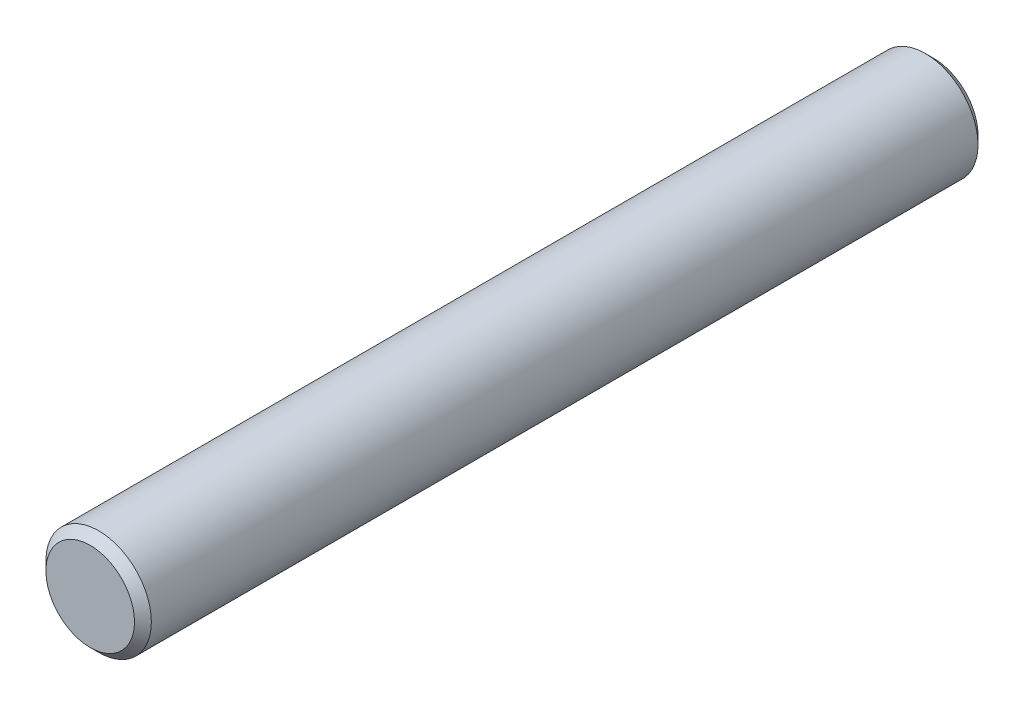
ISO-10303-21;
HEADER;
FILE_DESCRIPTION(('STEP AP214'),'2;1');
FILE_NAME('part.step','',(''),(''),'','','');
FILE_SCHEMA(('AUTOMOTIVE_DESIGN { 1 0 10303 214 1 1 1 1 }'));
ENDSEC;
DATA;
#1=APPLICATION_CONTEXT('core data for automotive mechanical design processes');
#2=APPLICATION_PROTOCOL_DEFINITION('international standard','automotive_design',2000,#1);
#3=PRODUCT_CONTEXT('',#1,'mechanical');
#4=PRODUCT('Part','Part','',(#3));
#5=PRODUCT_RELATED_PRODUCT_CATEGORY('part','',(#4));
#6=PRODUCT_DEFINITION_FORMATION('','',#4);
#7=PRODUCT_DEFINITION_CONTEXT('part definition',#1,'design');
#8=PRODUCT_DEFINITION('design','',#6,#7);
#9=PRODUCT_DEFINITION_SHAPE('','',#8);
#10=(LENGTH_UNIT() NAMED_UNIT(*) SI_UNIT(.MILLI.,.METRE.));
#11=(NAMED_UNIT(*) PLANE_ANGLE_UNIT() SI_UNIT($,.RADIAN.));
#12=(NAMED_UNIT(*) SI_UNIT($,.STERADIAN.) SOLID_ANGLE_UNIT());
#13=UNCERTAINTY_MEASURE_WITH_UNIT(LENGTH_MEASURE(1.E-05),#10,'distance_accuracy_value','');
#14=(GEOMETRIC_REPRESENTATION_CONTEXT(3) GLOBAL_UNCERTAINTY_ASSIGNED_CONTEXT((#13)) GLOBAL_UNIT_ASSIGNED_CONTEXT((#10,
#11,#12)) REPRESENTATION_CONTEXT('',''));
#15=CARTESIAN_POINT('',(0.,0.,0.));
#16=DIRECTION('',(0.,0.,1.));
#17=DIRECTION('',(1.,0.,0.));
#18=AXIS2_PLACEMENT_3D('',#15,#16,#17);
#19=CARTESIAN_POINT('',(0.,0.,25.4));
#20=DIRECTION('',(0.,0.,-1.));
#21=DIRECTION('',(-1.,0.,0.));
#22=AXIS2_PLACEMENT_3D('',#19,#20,#21);
#23=CYLINDRICAL_SURFACE('',#22,1.5875);
#24=CARTESIAN_POINT('',(0.,0.,25.146));
#25=DIRECTION('',(0.,0.,1.));
#26=DIRECTION('',(1.,0.,0.));
#27=AXIS2_PLACEMENT_3D('',#24,#25,#26);
#28=CIRCLE('',#27,1.5875);
#29=CARTESIAN_POINT('',(1.5875,0.,25.146));
#30=VERTEX_POINT('',#29);
#31=EDGE_CURVE('E38',#30,#30,#28,.F.);
#32=ORIENTED_EDGE('',*,*,#31,.T.);
#33=EDGE_LOOP('',(#32));
#34=FACE_BOUND('',#33,.T.);
#35=CARTESIAN_POINT('',(0.,0.,0.254000000000008));
#36=DIRECTION('',(0.,0.,1.));
#37=DIRECTION('',(1.,0.,0.));
#38=AXIS2_PLACEMENT_3D('',#35,#36,#37);
#39=CIRCLE('',#38,1.5875);
#40=CARTESIAN_POINT('',(1.5875,0.,0.254000000000008));
#41=VERTEX_POINT('',#40);
#42=EDGE_CURVE('E42',#41,#41,#39,.T.);
#43=ORIENTED_EDGE('',*,*,#42,.T.);
#44=EDGE_LOOP('',(#43));
#45=FACE_BOUND('',#44,.T.);
#46=ADVANCED_FACE('F31',(#34,#45),#23,.T.);
#47=CARTESIAN_POINT('',(0.,0.,25.4));
#48=DIRECTION('',(0.,0.,1.));
#49=DIRECTION('',(1.,0.,0.));
#50=AXIS2_PLACEMENT_3D('',#47,#48,#49);
#51=PLANE('',#50);
#52=CARTESIAN_POINT('',(0.,0.,25.4));
#53=DIRECTION('',(0.,0.,1.));
#54=DIRECTION('',(1.,0.,0.));
#55=AXIS2_PLACEMENT_3D('',#52,#53,#54);
#56=CIRCLE('',#55,1.3335);
#57=CARTESIAN_POINT('',(1.3335,0.,25.4));
#58=VERTEX_POINT('',#57);
#59=EDGE_CURVE('E46',#58,#58,#56,.T.);
#60=ORIENTED_EDGE('',*,*,#59,.T.);
#61=EDGE_LOOP('',(#60));
#62=FACE_BOUND('',#61,.T.);
#63=ADVANCED_FACE('F52',(#62),#51,.T.);
#64=CARTESIAN_POINT('',(0.,0.,0.));
#65=DIRECTION('',(0.,0.,1.));
#66=DIRECTION('',(1.,0.,0.));
#67=AXIS2_PLACEMENT_3D('',#64,#65,#66);
#68=PLANE('',#67);
#69=CARTESIAN_POINT('',(0.,0.,0.));
#70=DIRECTION('',(0.,0.,1.));
#71=DIRECTION('',(1.,0.,0.));
#72=AXIS2_PLACEMENT_3D('',#69,#70,#71);
#73=CIRCLE('',#72,1.33349999999999);
#74=CARTESIAN_POINT('',(1.33349999999999,0.,0.));
#75=VERTEX_POINT('',#74);
#76=EDGE_CURVE('E10',#75,#75,#73,.F.);
#77=ORIENTED_EDGE('',*,*,#76,.T.);
#78=EDGE_LOOP('',(#77));
#79=FACE_BOUND('',#78,.T.);
#80=ADVANCED_FACE('F56',(#79),#68,.F.);
#81=CARTESIAN_POINT('',(0.,0.,25.4));
#82=DIRECTION('',(0.,0.,-1.));
#83=DIRECTION('',(-1.,0.,0.));
#84=AXIS2_PLACEMENT_3D('',#81,#82,#83);
#85=CONICAL_SURFACE('',#84,1.3335,0.785398163397451);
#86=ORIENTED_EDGE('',*,*,#31,.F.);
#87=EDGE_LOOP('',(#86));
#88=FACE_BOUND('',#87,.T.);
#89=ORIENTED_EDGE('',*,*,#59,.F.);
#90=EDGE_LOOP('',(#89));
#91=FACE_BOUND('',#90,.T.);
#92=ADVANCED_FACE('F54',(#88,#91),#85,.T.);
#93=CARTESIAN_POINT('',(0.,0.,0.254000000000008));
#94=DIRECTION('',(0.,0.,1.));
#95=DIRECTION('',(1.,0.,0.));
#96=AXIS2_PLACEMENT_3D('',#93,#94,#95);
#97=CONICAL_SURFACE('',#96,1.5875,0.78539816339745);
#98=ORIENTED_EDGE('',*,*,#76,.F.);
#99=EDGE_LOOP('',(#98));
#100=FACE_BOUND('',#99,.T.);
#101=ORIENTED_EDGE('',*,*,#42,.F.);
#102=EDGE_LOOP('',(#101));
#103=FACE_BOUND('',#102,.T.);
#104=ADVANCED_FACE('F33',(#100,#103),#97,.T.);
#105=CLOSED_SHELL('',(#46,#63,#80,#92,#104));
#106=MANIFOLD_SOLID_BREP('B2',#105);
#107=ADVANCED_BREP_SHAPE_REPRESENTATION('',(#18,#106),#14);
#108=SHAPE_DEFINITION_REPRESENTATION(#9,#107);
ENDSEC;
END-ISO-10303-21;
